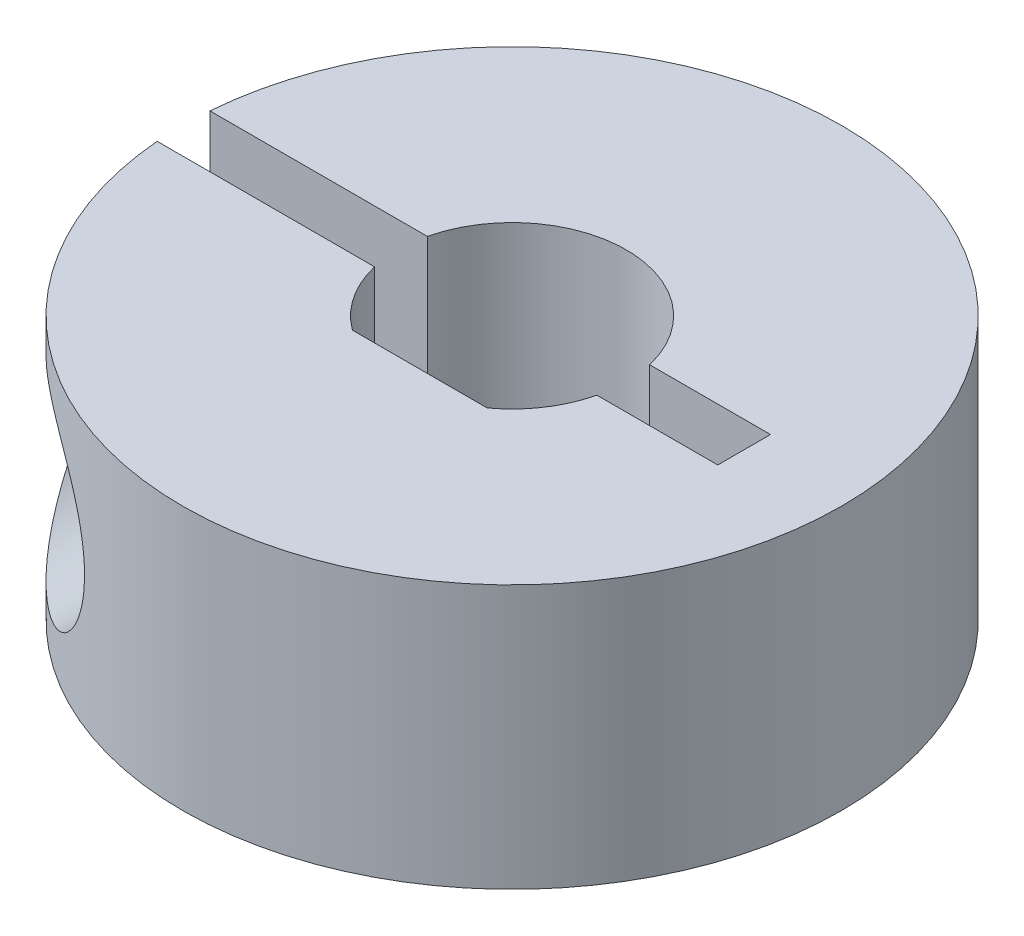
ISO-10303-21;
HEADER;
FILE_DESCRIPTION(('STEP AP214'),'2;1');
FILE_NAME('part.step','',(''),(''),'','','');
FILE_SCHEMA(('AUTOMOTIVE_DESIGN { 1 0 10303 214 1 1 1 1 }'));
ENDSEC;
DATA;
#1=APPLICATION_CONTEXT('core data for automotive mechanical design processes');
#2=APPLICATION_PROTOCOL_DEFINITION('international standard','automotive_design',2000,#1);
#3=PRODUCT_CONTEXT('',#1,'mechanical');
#4=PRODUCT('Part','Part','',(#3));
#5=PRODUCT_RELATED_PRODUCT_CATEGORY('part','',(#4));
#6=PRODUCT_DEFINITION_FORMATION('','',#4);
#7=PRODUCT_DEFINITION_CONTEXT('part definition',#1,'design');
#8=PRODUCT_DEFINITION('design','',#6,#7);
#9=PRODUCT_DEFINITION_SHAPE('','',#8);
#10=(LENGTH_UNIT() NAMED_UNIT(*) SI_UNIT(.MILLI.,.METRE.));
#11=(NAMED_UNIT(*) PLANE_ANGLE_UNIT() SI_UNIT($,.RADIAN.));
#12=(NAMED_UNIT(*) SI_UNIT($,.STERADIAN.) SOLID_ANGLE_UNIT());
#13=UNCERTAINTY_MEASURE_WITH_UNIT(LENGTH_MEASURE(1.E-05),#10,'distance_accuracy_value','');
#14=(GEOMETRIC_REPRESENTATION_CONTEXT(3) GLOBAL_UNCERTAINTY_ASSIGNED_CONTEXT((#13)) GLOBAL_UNIT_ASSIGNED_CONTEXT((#10,
#11,#12)) REPRESENTATION_CONTEXT('',''));
#15=CARTESIAN_POINT('',(0.,0.,0.));
#16=DIRECTION('',(0.,0.,1.));
#17=DIRECTION('',(1.,0.,0.));
#18=AXIS2_PLACEMENT_3D('',#15,#16,#17);
#19=CARTESIAN_POINT('',(-5.1,3.,1.));
#20=DIRECTION('',(0.,0.,1.));
#21=DIRECTION('',(1.,0.,0.));
#22=AXIS2_PLACEMENT_3D('',#19,#20,#21);
#23=CYLINDRICAL_SURFACE('',#22,1.2);
#24=CARTESIAN_POINT('',(-5.1,3.,1.));
#25=DIRECTION('',(0.,0.,1.));
#26=DIRECTION('',(1.,0.,0.));
#27=AXIS2_PLACEMENT_3D('',#24,#25,#26);
#28=CIRCLE('',#27,1.2);
#29=CARTESIAN_POINT('',(-3.9,3.,1.));
#30=VERTEX_POINT('',#29);
#31=EDGE_CURVE('E173',#30,#30,#28,.T.);
#32=ORIENTED_EDGE('',*,*,#31,.F.);
#33=EDGE_LOOP('',(#32));
#34=FACE_BOUND('',#33,.T.);
#35=CARTESIAN_POINT('',(-5.1,3.,3.));
#36=DIRECTION('',(0.,0.,1.));
#37=DIRECTION('',(1.,0.,0.));
#38=AXIS2_PLACEMENT_3D('',#35,#36,#37);
#39=CIRCLE('',#38,1.2);
#40=CARTESIAN_POINT('',(-3.9,3.,3.));
#41=VERTEX_POINT('',#40);
#42=EDGE_CURVE('E322',#41,#41,#39,.T.);
#43=ORIENTED_EDGE('',*,*,#42,.T.);
#44=EDGE_LOOP('',(#43));
#45=FACE_BOUND('',#44,.T.);
#46=ADVANCED_FACE('F43',(#34,#45),#23,.F.);
#47=CARTESIAN_POINT('',(-5.1,3.,1.));
#48=DIRECTION('',(0.,0.,1.));
#49=DIRECTION('',(1.,0.,0.));
#50=AXIS2_PLACEMENT_3D('',#47,#48,#49);
#51=PLANE('',#50);
#52=ORIENTED_EDGE('',*,*,#31,.T.);
#53=EDGE_LOOP('',(#52));
#54=FACE_BOUND('',#53,.T.);
#55=ADVANCED_FACE('F240',(#54),#51,.T.);
#56=CARTESIAN_POINT('',(-5.00289180238049,3.,7.5));
#57=DIRECTION('',(0.,0.,-1.));
#58=DIRECTION('',(-1.,0.,0.));
#59=AXIS2_PLACEMENT_3D('',#56,#57,#58);
#60=CYLINDRICAL_SURFACE('',#59,2.25);
#61=CARTESIAN_POINT('',(-6.87386354243376,1.75021411917,3.));
#62=CARTESIAN_POINT('',(-6.84514336746055,1.70724330427508,3.0658145929437));
#63=CARTESIAN_POINT('',(-6.81516819465504,1.66555217578708,3.13191010575274));
#64=CARTESIAN_POINT('',(-6.75270055703788,1.58462066491614,3.26441208257045));
#65=CARTESIAN_POINT('',(-6.72020809227526,1.54538028248546,3.33081854657306));
#66=CARTESIAN_POINT('',(-6.65263785772319,1.46917315907567,3.46381104087904));
#67=CARTESIAN_POINT('',(-6.61755554280518,1.43221063471329,3.5303971793205));
#68=CARTESIAN_POINT('',(-6.54484252941202,1.36064342128017,3.66343886202137));
#69=CARTESIAN_POINT('',(-6.50721181668045,1.32603874540204,3.72989440554805));
#70=CARTESIAN_POINT('',(-6.38954856601912,1.22504559063005,3.93037649436951));
#71=CARTESIAN_POINT('',(-6.30552429933281,1.16236125857017,4.06397319256161));
#72=CARTESIAN_POINT('',(-6.12686663500112,1.04797162040012,4.32862209617999));
#73=CARTESIAN_POINT('',(-6.03224226274425,0.996257081086065,4.45967635645737));
#74=CARTESIAN_POINT('',(-5.86725635996033,0.921425534691148,4.67296677351159));
#75=CARTESIAN_POINT('',(-5.79994656651594,0.894625817877258,4.75628390479375));
#76=CARTESIAN_POINT('',(-5.66089992122716,0.847112564089483,4.92095732320651));
#77=CARTESIAN_POINT('',(-5.58916321591468,0.826398825798741,5.0023136751156));
#78=CARTESIAN_POINT('',(-5.44170204938723,0.791911126046138,5.16233150828951));
#79=CARTESIAN_POINT('',(-5.36599285560214,0.778112477276814,5.2410016281868));
#80=CARTESIAN_POINT('',(-5.21071233329265,0.758251275718582,5.39541258624107));
#81=CARTESIAN_POINT('',(-5.13114196633303,0.752186807012471,5.47115414535357));
#82=CARTESIAN_POINT('',(-4.92445347705458,0.747872775226416,5.65936678517679));
#83=CARTESIAN_POINT('',(-4.79495237739256,0.755645242366067,5.76947988951533));
#84=CARTESIAN_POINT('',(-4.53109917931502,0.795988267348201,5.97891415043695));
#85=CARTESIAN_POINT('',(-4.39675177701858,0.828535402180042,6.07824539934521));
#86=CARTESIAN_POINT('',(-4.15261689004567,0.913589011363356,6.24689660181319));
#87=CARTESIAN_POINT('',(-4.04274411058669,0.961471463213277,6.31840441321241));
#88=CARTESIAN_POINT('',(-3.82747574452432,1.07754791314279,6.45107636916548));
#89=CARTESIAN_POINT('',(-3.72207853446985,1.14573447301925,6.51224428879105));
#90=CARTESIAN_POINT('',(-3.52011192592267,1.30284984091031,6.62361038838737));
#91=CARTESIAN_POINT('',(-3.42359821303967,1.39189852126495,6.67374179583125));
#92=CARTESIAN_POINT('',(-3.24543639202402,1.58881246763005,6.76217936379898));
#93=CARTESIAN_POINT('',(-3.16378273177717,1.69667067627869,6.80048994463671));
#94=CARTESIAN_POINT('',(-3.02768047694257,1.9156191048011,6.86208102540269));
#95=CARTESIAN_POINT('',(-2.97127163220871,2.02517061302621,6.88652005559272));
#96=CARTESIAN_POINT('',(-2.87678057830789,2.25341436961978,6.9265275935542));
#97=CARTESIAN_POINT('',(-2.83869305421648,2.37210395547276,6.94209867411535));
#98=CARTESIAN_POINT('',(-2.7839551494487,2.60899498878214,6.96422467302576));
#99=CARTESIAN_POINT('',(-2.76635432800776,2.72694071784374,6.97118038806068));
#100=CARTESIAN_POINT('',(-2.75003229855003,2.96432837435543,6.97763599928819));
#101=CARTESIAN_POINT('',(-2.75130884223376,3.08377012193629,6.97713678336507));
#102=CARTESIAN_POINT('',(-2.77257404404054,3.31942645469555,6.96871270661956));
#103=CARTESIAN_POINT('',(-2.79236461939619,3.43566181209186,6.96086645139139));
#104=CARTESIAN_POINT('',(-2.84957571151077,3.66291539568349,6.93764099828048));
#105=CARTESIAN_POINT('',(-2.88699542923405,3.77393385808225,6.92226214180941));
#106=CARTESIAN_POINT('',(-2.97805203908749,3.98796975361054,6.88357785911471));
#107=CARTESIAN_POINT('',(-3.03173127356089,4.09096540292061,6.86025171687176));
#108=CARTESIAN_POINT('',(-3.15301719588664,4.28594235607694,6.8053579076353));
#109=CARTESIAN_POINT('',(-3.22062360063832,4.37792388374959,6.7737904081622));
#110=CARTESIAN_POINT('',(-3.36848063102568,4.55060947079113,6.70150949417233));
#111=CARTESIAN_POINT('',(-3.44896604793873,4.6310375629513,6.66061867262551));
#112=CARTESIAN_POINT('',(-3.618178363544,4.7769530035665,6.57023428147925));
#113=CARTESIAN_POINT('',(-3.70690687385683,4.84243742167291,6.52073902795833));
#114=CARTESIAN_POINT('',(-3.89529924034776,4.96188468711795,6.41009656758613));
#115=CARTESIAN_POINT('',(-3.99529824331537,5.01479968923515,6.34839538273607));
#116=CARTESIAN_POINT('',(-4.19730898134768,5.10374270256589,6.21668268570796));
#117=CARTESIAN_POINT('',(-4.29932176191436,5.13976168798583,6.14666675679067));
#118=CARTESIAN_POINT('',(-4.4727775747814,5.18793513703765,6.0209782854254));
#119=CARTESIAN_POINT('',(-4.54446529356828,5.20398530991342,5.96707235264336));
#120=CARTESIAN_POINT('',(-4.68663275178896,5.22883120840226,5.85607565820179));
#121=CARTESIAN_POINT('',(-4.75711209121311,5.23762457552605,5.79898386755749));
#122=CARTESIAN_POINT('',(-4.9659591261406,5.25402986772425,5.62336470723954));
#123=CARTESIAN_POINT('',(-5.10163020480338,5.25163987097105,5.50056981683602));
#124=CARTESIAN_POINT('',(-5.32150258152356,5.22915029821429,5.2865256214974));
#125=CARTESIAN_POINT('',(-5.40853685689313,5.2148196314692,5.19741299388768));
#126=CARTESIAN_POINT('',(-5.57722422031252,5.17717810874831,5.01596321239898));
#127=CARTESIAN_POINT('',(-5.65887524673883,5.15386383544702,4.92362484363136));
#128=CARTESIAN_POINT('',(-5.81666176089845,5.09934965676656,4.73619143729148));
#129=CARTESIAN_POINT('',(-5.89278175622056,5.06812862334062,4.64108962788111));
#130=CARTESIAN_POINT('',(-6.03918214493924,4.99879029236199,4.44891793325777));
#131=CARTESIAN_POINT('',(-6.10946151918054,4.9606717949126,4.35184770822825));
#132=CARTESIAN_POINT('',(-6.24806850281715,4.8759035027134,4.1505930745781));
#133=CARTESIAN_POINT('',(-6.31604610525391,4.82888696694417,4.04632274552977));
#134=CARTESIAN_POINT('',(-6.44550183803214,4.72860694182086,3.83675369021599));
#135=CARTESIAN_POINT('',(-6.50697914772509,4.67534266548873,3.73145483593012));
#136=CARTESIAN_POINT('',(-6.62295897847548,4.56343164561002,3.52145673501557));
#137=CARTESIAN_POINT('',(-6.6775221617249,4.50484078758067,3.41676128328699));
#138=CARTESIAN_POINT('',(-6.75466761552686,4.41258141494622,3.26003934364243));
#139=CARTESIAN_POINT('',(-6.77959592536628,4.3811048415694,3.20786057907936));
#140=CARTESIAN_POINT('',(-6.82789616176746,4.31661567984451,3.10372868998453));
#141=CARTESIAN_POINT('',(-6.85126801081366,4.28360301513419,3.05177557681102));
#142=CARTESIAN_POINT('',(-6.87386354243376,4.24978588083,3.));
#143=B_SPLINE_CURVE_WITH_KNOTS('',3,(#61,#62,#63,#64,#65,#66,#67,#68,#69,#70,#71,#72,#73,#74,
#75,#76,#77,#78,#79,#80,#81,#82,#83,#84,#85,#86,#87,#88,#89,#90,#91,#92,#93,#94,#95,#96,#97,#98,
#99,#100,#101,#102,#103,#104,#105,#106,#107,#108,#109,#110,#111,#112,#113,#114,#115,#116,#117,
#118,#119,#120,#121,#122,#123,#124,#125,#126,#127,#128,#129,#130,#131,#132,#133,#134,#135,#136,
#137,#138,#139,#140,#141,#142),.UNSPECIFIED.,.F.,.F.,(4,2,2,2,2,2,2,2,2,2,2,2,2,2,2,2,2,2,2,2,2,
2,2,2,2,2,2,2,2,2,2,2,2,2,2,2,2,2,2,2,4),(0.,0.251021942592843,0.502043880295764,
0.75351733766447,1.00499220195967,1.51375279389565,2.02208345107432,2.35307819507163,
2.68406198892748,3.01385557852207,3.34356745550883,3.85209380336044,4.36013996529898,
4.77710996749608,5.19392740451478,5.61320127665754,6.03231817377849,6.40726267472243,
6.78209834042831,7.13874748988281,7.49535416266561,7.84818858948757,8.20100702573215,
8.55475227338067,8.90849033108075,9.26962361165777,9.63082764717771,10.0159100299542,
10.4011978887996,10.6741991411284,10.9472890849919,11.4938632139342,11.8695968482162,
12.2454735512887,12.6223654509059,12.9993229785383,13.3981583941002,13.7970441018382,
14.1921438278654,14.3896303579807,14.5871267160664),.UNSPECIFIED.);
#144=CARTESIAN_POINT('',(-6.87386354243376,1.75021411917,3.));
#145=VERTEX_POINT('',#144);
#146=CARTESIAN_POINT('',(-6.87386354243376,4.24978588083,3.));
#147=VERTEX_POINT('',#146);
#148=EDGE_CURVE('E11',#145,#147,#143,.T.);
#149=ORIENTED_EDGE('',*,*,#148,.T.);
#150=CARTESIAN_POINT('',(-5.00289180238049,3.,3.));
#151=DIRECTION('',(0.,0.,1.));
#152=DIRECTION('',(1.,0.,0.));
#153=AXIS2_PLACEMENT_3D('',#150,#151,#152);
#154=CIRCLE('',#153,2.25);
#155=EDGE_CURVE('E60',#145,#147,#154,.T.);
#156=ORIENTED_EDGE('',*,*,#155,.F.);
#157=EDGE_LOOP('',(#149,#156));
#158=FACE_BOUND('',#157,.T.);
#159=ADVANCED_FACE('F234',(#158),#60,.F.);
#160=CARTESIAN_POINT('',(-5.00289180238049,3.,3.));
#161=DIRECTION('',(0.,0.,1.));
#162=DIRECTION('',(1.,0.,0.));
#163=AXIS2_PLACEMENT_3D('',#160,#161,#162);
#164=PLANE('',#163);
#165=ORIENTED_EDGE('',*,*,#42,.F.);
#166=EDGE_LOOP('',(#165));
#167=FACE_BOUND('',#166,.T.);
#168=DIRECTION('',(0.,-1.,0.));
#169=VECTOR('',#168,1.);
#170=CARTESIAN_POINT('',(-6.87386354243376,6.,3.));
#171=LINE('',#170,#169);
#172=EDGE_CURVE('E54',#147,#145,#171,.T.);
#173=ORIENTED_EDGE('',*,*,#172,.T.);
#174=ORIENTED_EDGE('',*,*,#155,.T.);
#175=EDGE_LOOP('',(#173,#174));
#176=FACE_BOUND('',#175,.T.);
#177=ADVANCED_FACE('F239',(#167,#176),#164,.T.);
#178=CARTESIAN_POINT('',(0.,6.,0.));
#179=DIRECTION('',(0.,-1.,0.));
#180=DIRECTION('',(0.,0.,-1.));
#181=AXIS2_PLACEMENT_3D('',#178,#179,#180);
#182=CYLINDRICAL_SURFACE('',#181,7.5);
#183=CARTESIAN_POINT('',(-4.015,3.,-6.33480662688294));
#184=CARTESIAN_POINT('',(-4.01500341673465,3.05348955366232,-6.3348051350838));
#185=CARTESIAN_POINT('',(-4.01898062277794,3.10703852283346,-6.33228912967999));
#186=CARTESIAN_POINT('',(-4.03468449784157,3.21256531529099,-6.32229415504269));
#187=CARTESIAN_POINT('',(-4.04642456460871,3.26454025952914,-6.31480660543988));
#188=CARTESIAN_POINT('',(-4.07697190949871,3.36523575540195,-6.29512716706745));
#189=CARTESIAN_POINT('',(-4.09575691217133,3.41396600052346,-6.28295010289053));
#190=CARTESIAN_POINT('',(-4.13945211238199,3.50717265460946,-6.25424784255655));
#191=CARTESIAN_POINT('',(-4.16436124711331,3.5516497998159,-6.2377234008262));
#192=CARTESIAN_POINT('',(-4.22045042684689,3.63746605159121,-6.19991846019641));
#193=CARTESIAN_POINT('',(-4.25186333738993,3.67857189618531,-6.17845649535215));
#194=CARTESIAN_POINT('',(-4.31889091442411,3.75476626871302,-6.131790112999));
#195=CARTESIAN_POINT('',(-4.35450708249521,3.78985263518617,-6.10658435721439));
#196=CARTESIAN_POINT('',(-4.43389300199358,3.85827713523543,-6.0492398496911));
#197=CARTESIAN_POINT('',(-4.47810826140357,3.89069634026397,-6.01662439989254));
#198=CARTESIAN_POINT('',(-4.56889160441162,3.9476427741786,-5.94798146285112));
#199=CARTESIAN_POINT('',(-4.61546153973329,3.97216367652555,-5.91195127014704));
#200=CARTESIAN_POINT('',(-4.73224883804518,4.02360834748027,-5.81925101369104));
#201=CARTESIAN_POINT('',(-4.80313823457782,4.04608717657006,-5.76094143092151));
#202=CARTESIAN_POINT('',(-4.94446871309752,4.07623244608567,-5.64011812391005));
#203=CARTESIAN_POINT('',(-5.01490882888358,4.08387365785588,-5.57759742581558));
#204=CARTESIAN_POINT('',(-5.17015967955018,4.0861395223418,-5.43443617645868));
#205=CARTESIAN_POINT('',(-5.25434035899845,4.0771815487492,-5.35306131996549));
#206=CARTESIAN_POINT('',(-5.41702565743701,4.04100498031075,-5.18837821427705));
#207=CARTESIAN_POINT('',(-5.4955162438066,4.01374283574663,-5.10506581265534));
#208=CARTESIAN_POINT('',(-5.6079886320274,3.9596475514279,-4.98032823645102));
#209=CARTESIAN_POINT('',(-5.64479592099652,3.93926130163159,-4.93855095711596));
#210=CARTESIAN_POINT('',(-5.71627941162541,3.89398829176345,-4.85562931979364));
#211=CARTESIAN_POINT('',(-5.75095671295823,3.86910388062464,-4.81448464357256));
#212=CARTESIAN_POINT('',(-5.81780765254223,3.81475600895106,-4.73348325946805));
#213=CARTESIAN_POINT('',(-5.84998941889333,3.78530843943108,-4.69362264078427));
#214=CARTESIAN_POINT('',(-5.91157957845374,3.72147697028081,-4.61580777890537));
#215=CARTESIAN_POINT('',(-5.94099118179187,3.68709890378771,-4.57785135354266));
#216=CARTESIAN_POINT('',(-5.99344109786722,3.61699874992589,-4.50891657082794));
#217=CARTESIAN_POINT('',(-6.01682456939453,3.58184243701466,-4.47763020192026));
#218=CARTESIAN_POINT('',(-6.06032788341993,3.5068258654049,-4.41857059617814));
#219=CARTESIAN_POINT('',(-6.08045034713272,3.46696942966271,-4.39079454172905));
#220=CARTESIAN_POINT('',(-6.11353779102296,3.38916584653191,-4.34457478732529));
#221=CARTESIAN_POINT('',(-6.12713455702635,3.35196185943643,-4.32534801487973));
#222=CARTESIAN_POINT('',(-6.15055610531774,3.27421825770889,-4.29197825206541));
#223=CARTESIAN_POINT('',(-6.16038735749879,3.23368451116157,-4.2778265444275));
#224=CARTESIAN_POINT('',(-6.17398903312116,3.15798146265463,-4.25816575567804));
#225=CARTESIAN_POINT('',(-6.17855529646182,3.12325269996208,-4.25152658881075));
#226=CARTESIAN_POINT('',(-6.18428039363398,3.05293408341792,-4.24319493362013));
#227=CARTESIAN_POINT('',(-6.18544186925664,3.01734491878693,-4.24149861012699));
#228=CARTESIAN_POINT('',(-6.18425423160318,2.94633937586732,-4.24322992836885));
#229=CARTESIAN_POINT('',(-6.1819036148408,2.91092307809355,-4.24665976455392));
#230=CARTESIAN_POINT('',(-6.17390022978676,2.84126693448786,-4.25828652432629));
#231=CARTESIAN_POINT('',(-6.16824458123418,2.80702814241773,-4.26648760591902));
#232=CARTESIAN_POINT('',(-6.15189110630574,2.7303370798303,-4.29004611267863));
#233=CARTESIAN_POINT('',(-6.1401847536936,2.68853944433576,-4.30681895761351));
#234=CARTESIAN_POINT('',(-6.11288886679776,2.60875951970556,-4.34547477616115));
#235=CARTESIAN_POINT('',(-6.09729099015716,2.57078567642739,-4.36736872162278));
#236=CARTESIAN_POINT('',(-6.05388507311197,2.47933317531338,-4.42746797342534));
#237=CARTESIAN_POINT('',(-6.02401532908021,2.42846336576144,-4.4681233705646));
#238=CARTESIAN_POINT('',(-5.95910382770025,2.33485312361478,-4.55434055995884));
#239=CARTESIAN_POINT('',(-5.92404955306475,2.29213295526797,-4.59991415240176));
#240=CARTESIAN_POINT('',(-5.85836701193417,2.2229384556394,-4.68312647443183));
#241=CARTESIAN_POINT('',(-5.82855721217563,2.19498233870916,-4.72019932405328));
#242=CARTESIAN_POINT('',(-5.76682075764876,2.14314512635089,-4.79543043672289));
#243=CARTESIAN_POINT('',(-5.73489303441219,2.11926610981905,-4.83358924199497));
#244=CARTESIAN_POINT('',(-5.63624945989467,2.05346839522171,-4.94902993293104));
#245=CARTESIAN_POINT('',(-5.5666747241499,2.01739058652626,-5.02727414829057));
#246=CARTESIAN_POINT('',(-5.41935829865167,1.95997334358773,-5.18581007327568));
#247=CARTESIAN_POINT('',(-5.34144207220131,1.93907647494963,-5.26609754490103));
#248=CARTESIAN_POINT('',(-5.18066655635745,1.91496311528892,-5.42432948863842));
#249=CARTESIAN_POINT('',(-5.0978139335292,1.91172330217349,-5.50227691608397));
#250=CARTESIAN_POINT('',(-4.94755286635842,1.92371764771268,-5.63734493746068));
#251=CARTESIAN_POINT('',(-4.88063669967706,1.93514417638944,-5.69535090593003));
#252=CARTESIAN_POINT('',(-4.74701160212433,1.97169707025619,-5.80718743466338));
#253=CARTESIAN_POINT('',(-4.68030251833578,1.99680680118408,-5.86102297421644));
#254=CARTESIAN_POINT('',(-4.56293097725754,2.0554478032015,-5.95265129519667));
#255=CARTESIAN_POINT('',(-4.51173876486878,2.08627102172864,-5.9914933997724));
#256=CARTESIAN_POINT('',(-4.41312096128956,2.15790515200411,-6.06449593770924));
#257=CARTESIAN_POINT('',(-4.36569105231279,2.19870438859472,-6.09866177143235));
#258=CARTESIAN_POINT('',(-4.2839243285766,2.28297163675549,-6.15630548044958));
#259=CARTESIAN_POINT('',(-4.24870209824042,2.32500565951047,-6.18061917506632));
#260=CARTESIAN_POINT('',(-4.18412666540861,2.41562711040452,-6.2245168195216));
#261=CARTESIAN_POINT('',(-4.15477415488214,2.4642153100727,-6.24410021177106));
#262=CARTESIAN_POINT('',(-4.10336517237299,2.56724079531082,-6.27800564032322));
#263=CARTESIAN_POINT('',(-4.08135637067195,2.62171337037392,-6.29229336465322));
#264=CARTESIAN_POINT('',(-4.04631772229561,2.73457442084717,-6.31488371005586));
#265=CARTESIAN_POINT('',(-4.03326635240318,2.79295313701484,-6.32320068008735));
#266=CARTESIAN_POINT('',(-4.02175334367412,2.87662223589476,-6.33052220433555));
#267=CARTESIAN_POINT('',(-4.01922508574751,2.90119814716857,-6.33212709558405));
#268=CARTESIAN_POINT('',(-4.01584764969188,2.95051180195049,-6.33426963529976));
#269=CARTESIAN_POINT('',(-4.01499841902302,2.97524954037043,-6.33480731716191));
#270=CARTESIAN_POINT('',(-4.015,3.,-6.33480662688294));
#271=B_SPLINE_CURVE_WITH_KNOTS('',3,(#183,#184,#185,#186,#187,#188,#189,#190,#191,#192,#193,
#194,#195,#196,#197,#198,#199,#200,#201,#202,#203,#204,#205,#206,#207,#208,#209,#210,#211,#212,
#213,#214,#215,#216,#217,#218,#219,#220,#221,#222,#223,#224,#225,#226,#227,#228,#229,#230,#231,
#232,#233,#234,#235,#236,#237,#238,#239,#240,#241,#242,#243,#244,#245,#246,#247,#248,#249,#250,
#251,#252,#253,#254,#255,#256,#257,#258,#259,#260,#261,#262,#263,#264,#265,#266,#267,#268,#269,
#270),.UNSPECIFIED.,.T.,.F.,(4,2,2,2,2,2,2,2,2,2,2,2,2,2,2,2,2,2,2,2,2,2,2,2,2,2,2,2,2,2,2,2,2,
2,2,2,2,2,2,2,2,2,2,4),(0.,0.160369376208794,0.321016255273978,0.481159408317814,
0.641274789062684,0.808639770935063,0.976064724628677,1.16673291826196,1.35755345947203,
1.63950342230103,1.92193237114998,2.27245758298603,2.62381974201019,2.80153115175063,
2.97915002755233,3.15616370557318,3.33296966506322,3.49028814482599,3.64747953716923,
3.77911365957614,3.91052058308015,4.01700586906495,4.12340851070681,4.22985671514576,
4.33639782543818,4.47521995491429,4.61434227711114,4.82808765314693,5.04235777494466,
5.20767554615037,5.37307736206745,5.70388964462102,6.04399636883553,6.38365375842484,
6.65057336946613,6.91716921581238,7.13016684680134,7.34291638507388,7.52213620932931,
7.70137714900094,7.88175993483504,8.06170775897888,8.1359155193699,8.21012095762675),.UNSPECIFIED.);
#272=CARTESIAN_POINT('',(-4.015,3.,-6.33480662688294));
#273=VERTEX_POINT('',#272);
#274=EDGE_CURVE('E331',#273,#273,#271,.T.);
#275=ORIENTED_EDGE('',*,*,#274,.T.);
#276=EDGE_LOOP('',(#275));
#277=FACE_BOUND('',#276,.T.);
#278=CARTESIAN_POINT('',(0.,0.,0.));
#279=DIRECTION('',(0.,1.,0.));
#280=DIRECTION('',(0.,0.,1.));
#281=AXIS2_PLACEMENT_3D('',#278,#279,#280);
#282=CIRCLE('',#281,7.5);
#283=CARTESIAN_POINT('',(-7.47596147662627,0.,0.600000000000002));
#284=VERTEX_POINT('',#283);
#285=CARTESIAN_POINT('',(-7.47596147662627,0.,-0.599999999999998));
#286=VERTEX_POINT('',#285);
#287=EDGE_CURVE('E168',#284,#286,#282,.T.);
#288=ORIENTED_EDGE('',*,*,#287,.T.);
#289=DIRECTION('',(0.,-1.,0.));
#290=VECTOR('',#289,1.);
#291=CARTESIAN_POINT('',(-7.47596147662627,6.,-0.599999999999998));
#292=LINE('',#291,#290);
#293=CARTESIAN_POINT('',(-7.47596147662627,6.,-0.599999999999998));
#294=VERTEX_POINT('',#293);
#295=EDGE_CURVE('E225',#294,#286,#292,.T.);
#296=ORIENTED_EDGE('',*,*,#295,.F.);
#297=CARTESIAN_POINT('',(0.,6.,0.));
#298=DIRECTION('',(0.,1.,0.));
#299=DIRECTION('',(0.,0.,1.));
#300=AXIS2_PLACEMENT_3D('',#297,#298,#299);
#301=CIRCLE('',#300,7.5);
#302=CARTESIAN_POINT('',(-7.47596147662627,6.,0.600000000000002));
#303=VERTEX_POINT('',#302);
#304=EDGE_CURVE('E198',#303,#294,#301,.T.);
#305=ORIENTED_EDGE('',*,*,#304,.F.);
#306=DIRECTION('',(0.,-1.,0.));
#307=VECTOR('',#306,1.);
#308=CARTESIAN_POINT('',(-7.47596147662627,6.,0.600000000000002));
#309=LINE('',#308,#307);
#310=EDGE_CURVE('E164',#303,#284,#309,.T.);
#311=ORIENTED_EDGE('',*,*,#310,.T.);
#312=EDGE_LOOP('',(#288,#296,#305,#311));
#313=FACE_BOUND('',#312,.T.);
#314=ORIENTED_EDGE('',*,*,#148,.F.);
#315=ORIENTED_EDGE('',*,*,#172,.F.);
#316=EDGE_LOOP('',(#314,#315));
#317=FACE_BOUND('',#316,.T.);
#318=ADVANCED_FACE('F45',(#277,#313,#317),#182,.T.);
#319=CARTESIAN_POINT('',(-7.47596147662627,6.,-0.599999999999998));
#320=DIRECTION('',(0.,0.,-1.));
#321=DIRECTION('',(-1.,0.,0.));
#322=AXIS2_PLACEMENT_3D('',#319,#320,#321);
#323=PLANE('',#322);
#324=CARTESIAN_POINT('',(-5.1,3.,-0.599999999999998));
#325=DIRECTION('',(0.,0.,-1.));
#326=DIRECTION('',(-1.,0.,0.));
#327=AXIS2_PLACEMENT_3D('',#324,#325,#326);
#328=CIRCLE('',#327,1.085);
#329=CARTESIAN_POINT('',(-6.185,3.,-0.599999999999998));
#330=VERTEX_POINT('',#329);
#331=EDGE_CURVE('E48',#330,#330,#328,.T.);
#332=ORIENTED_EDGE('',*,*,#331,.T.);
#333=EDGE_LOOP('',(#332));
#334=FACE_BOUND('',#333,.T.);
#335=DIRECTION('',(1.,0.,0.));
#336=VECTOR('',#335,1.);
#337=CARTESIAN_POINT('',(-7.47596147662627,0.,-0.599999999999998));
#338=LINE('',#337,#336);
#339=CARTESIAN_POINT('',(-2.5298221281347,0.,-0.599999999999998));
#340=VERTEX_POINT('',#339);
#341=EDGE_CURVE('E172',#286,#340,#338,.T.);
#342=ORIENTED_EDGE('',*,*,#341,.T.);
#343=DIRECTION('',(0.,-1.,0.));
#344=VECTOR('',#343,1.);
#345=CARTESIAN_POINT('',(-2.5298221281347,6.,-0.599999999999998));
#346=LINE('',#345,#344);
#347=CARTESIAN_POINT('',(-2.5298221281347,6.,-0.599999999999998));
#348=VERTEX_POINT('',#347);
#349=EDGE_CURVE('E221',#348,#340,#346,.T.);
#350=ORIENTED_EDGE('',*,*,#349,.F.);
#351=DIRECTION('',(1.,0.,0.));
#352=VECTOR('',#351,1.);
#353=CARTESIAN_POINT('',(-7.47596147662627,6.,-0.599999999999998));
#354=LINE('',#353,#352);
#355=EDGE_CURVE('E116',#294,#348,#354,.T.);
#356=ORIENTED_EDGE('',*,*,#355,.F.);
#357=ORIENTED_EDGE('',*,*,#295,.T.);
#358=EDGE_LOOP('',(#342,#350,#356,#357));
#359=FACE_BOUND('',#358,.T.);
#360=ADVANCED_FACE('F281',(#334,#359),#323,.F.);
#361=CARTESIAN_POINT('',(0.,6.,0.));
#362=DIRECTION('',(0.,-1.,0.));
#363=DIRECTION('',(0.,0.,-1.));
#364=AXIS2_PLACEMENT_3D('',#361,#362,#363);
#365=CYLINDRICAL_SURFACE('',#364,2.6);
#366=CARTESIAN_POINT('',(0.,0.,0.));
#367=DIRECTION('',(0.,-1.,0.));
#368=DIRECTION('',(0.,0.,1.));
#369=AXIS2_PLACEMENT_3D('',#366,#367,#368);
#370=CIRCLE('',#369,2.6);
#371=CARTESIAN_POINT('',(2.5298221281347,0.,-0.6));
#372=VERTEX_POINT('',#371);
#373=EDGE_CURVE('E176',#340,#372,#370,.T.);
#374=ORIENTED_EDGE('',*,*,#373,.T.);
#375=DIRECTION('',(0.,-1.,0.));
#376=VECTOR('',#375,1.);
#377=CARTESIAN_POINT('',(2.5298221281347,6.,-0.6));
#378=LINE('',#377,#376);
#379=CARTESIAN_POINT('',(2.5298221281347,6.,-0.6));
#380=VERTEX_POINT('',#379);
#381=EDGE_CURVE('E217',#380,#372,#378,.T.);
#382=ORIENTED_EDGE('',*,*,#381,.F.);
#383=CARTESIAN_POINT('',(0.,6.,0.));
#384=DIRECTION('',(0.,-1.,0.));
#385=DIRECTION('',(0.,0.,1.));
#386=AXIS2_PLACEMENT_3D('',#383,#384,#385);
#387=CIRCLE('',#386,2.6);
#388=EDGE_CURVE('E296',#348,#380,#387,.T.);
#389=ORIENTED_EDGE('',*,*,#388,.F.);
#390=ORIENTED_EDGE('',*,*,#349,.T.);
#391=EDGE_LOOP('',(#374,#382,#389,#390));
#392=FACE_BOUND('',#391,.T.);
#393=ADVANCED_FACE('F278',(#392),#365,.F.);
#394=CARTESIAN_POINT('',(2.5298221281347,6.,-0.6));
#395=DIRECTION('',(0.,0.,-1.));
#396=DIRECTION('',(-1.,0.,0.));
#397=AXIS2_PLACEMENT_3D('',#394,#395,#396);
#398=PLANE('',#397);
#399=DIRECTION('',(1.,0.,0.));
#400=VECTOR('',#399,1.);
#401=CARTESIAN_POINT('',(2.5298221281347,0.,-0.6));
#402=LINE('',#401,#400);
#403=CARTESIAN_POINT('',(5.2798221281347,0.,-0.6));
#404=VERTEX_POINT('',#403);
#405=EDGE_CURVE('E179',#372,#404,#402,.T.);
#406=ORIENTED_EDGE('',*,*,#405,.T.);
#407=DIRECTION('',(0.,-1.,0.));
#408=VECTOR('',#407,1.);
#409=CARTESIAN_POINT('',(5.2798221281347,6.,-0.6));
#410=LINE('',#409,#408);
#411=CARTESIAN_POINT('',(5.2798221281347,6.,-0.6));
#412=VERTEX_POINT('',#411);
#413=EDGE_CURVE('E213',#412,#404,#410,.T.);
#414=ORIENTED_EDGE('',*,*,#413,.F.);
#415=DIRECTION('',(1.,0.,0.));
#416=VECTOR('',#415,1.);
#417=CARTESIAN_POINT('',(2.5298221281347,6.,-0.6));
#418=LINE('',#417,#416);
#419=EDGE_CURVE('E308',#380,#412,#418,.T.);
#420=ORIENTED_EDGE('',*,*,#419,.F.);
#421=ORIENTED_EDGE('',*,*,#381,.T.);
#422=EDGE_LOOP('',(#406,#414,#420,#421));
#423=FACE_BOUND('',#422,.T.);
#424=ADVANCED_FACE('F274',(#423),#398,.F.);
#425=CARTESIAN_POINT('',(5.2798221281347,6.,-0.6));
#426=DIRECTION('',(1.,0.,0.));
#427=DIRECTION('',(0.,0.,-1.));
#428=AXIS2_PLACEMENT_3D('',#425,#426,#427);
#429=PLANE('',#428);
#430=DIRECTION('',(0.,0.,1.));
#431=VECTOR('',#430,1.);
#432=CARTESIAN_POINT('',(5.2798221281347,0.,-0.6));
#433=LINE('',#432,#431);
#434=CARTESIAN_POINT('',(5.2798221281347,0.,0.6));
#435=VERTEX_POINT('',#434);
#436=EDGE_CURVE('E182',#404,#435,#433,.T.);
#437=ORIENTED_EDGE('',*,*,#436,.T.);
#438=DIRECTION('',(0.,-1.,0.));
#439=VECTOR('',#438,1.);
#440=CARTESIAN_POINT('',(5.2798221281347,6.,0.6));
#441=LINE('',#440,#439);
#442=CARTESIAN_POINT('',(5.2798221281347,6.,0.6));
#443=VERTEX_POINT('',#442);
#444=EDGE_CURVE('E209',#443,#435,#441,.T.);
#445=ORIENTED_EDGE('',*,*,#444,.F.);
#446=DIRECTION('',(0.,0.,1.));
#447=VECTOR('',#446,1.);
#448=CARTESIAN_POINT('',(5.2798221281347,6.,-0.6));
#449=LINE('',#448,#447);
#450=EDGE_CURVE('E304',#412,#443,#449,.T.);
#451=ORIENTED_EDGE('',*,*,#450,.F.);
#452=ORIENTED_EDGE('',*,*,#413,.T.);
#453=EDGE_LOOP('',(#437,#445,#451,#452));
#454=FACE_BOUND('',#453,.T.);
#455=ADVANCED_FACE('F270',(#454),#429,.F.);
#456=CARTESIAN_POINT('',(5.2798221281347,6.,0.6));
#457=DIRECTION('',(0.,0.,1.));
#458=DIRECTION('',(1.,0.,0.));
#459=AXIS2_PLACEMENT_3D('',#456,#457,#458);
#460=PLANE('',#459);
#461=DIRECTION('',(-1.,0.,0.));
#462=VECTOR('',#461,1.);
#463=CARTESIAN_POINT('',(5.2798221281347,0.,0.6));
#464=LINE('',#463,#462);
#465=CARTESIAN_POINT('',(2.5298221281347,0.,0.600000000000001));
#466=VERTEX_POINT('',#465);
#467=EDGE_CURVE('E185',#435,#466,#464,.T.);
#468=ORIENTED_EDGE('',*,*,#467,.T.);
#469=DIRECTION('',(0.,-1.,0.));
#470=VECTOR('',#469,1.);
#471=CARTESIAN_POINT('',(2.5298221281347,6.,0.600000000000001));
#472=LINE('',#471,#470);
#473=CARTESIAN_POINT('',(2.5298221281347,6.,0.600000000000001));
#474=VERTEX_POINT('',#473);
#475=EDGE_CURVE('E205',#474,#466,#472,.T.);
#476=ORIENTED_EDGE('',*,*,#475,.F.);
#477=DIRECTION('',(-1.,0.,0.));
#478=VECTOR('',#477,1.);
#479=CARTESIAN_POINT('',(5.2798221281347,6.,0.6));
#480=LINE('',#479,#478);
#481=EDGE_CURVE('E307',#443,#474,#480,.T.);
#482=ORIENTED_EDGE('',*,*,#481,.F.);
#483=ORIENTED_EDGE('',*,*,#444,.T.);
#484=EDGE_LOOP('',(#468,#476,#482,#483));
#485=FACE_BOUND('',#484,.T.);
#486=ADVANCED_FACE('F266',(#485),#460,.F.);
#487=CARTESIAN_POINT('',(0.,6.,0.));
#488=DIRECTION('',(0.,-1.,0.));
#489=DIRECTION('',(0.,0.,-1.));
#490=AXIS2_PLACEMENT_3D('',#487,#488,#489);
#491=CYLINDRICAL_SURFACE('',#490,2.6);
#492=CARTESIAN_POINT('',(0.,0.,0.));
#493=DIRECTION('',(0.,-1.,0.));
#494=DIRECTION('',(0.,0.,1.));
#495=AXIS2_PLACEMENT_3D('',#492,#493,#494);
#496=CIRCLE('',#495,2.6);
#497=CARTESIAN_POINT('',(1.53297097167559,0.,2.1));
#498=VERTEX_POINT('',#497);
#499=EDGE_CURVE('E188',#466,#498,#496,.T.);
#500=ORIENTED_EDGE('',*,*,#499,.T.);
#501=DIRECTION('',(0.,-1.,0.));
#502=VECTOR('',#501,1.);
#503=CARTESIAN_POINT('',(1.53297097167559,6.,2.1));
#504=LINE('',#503,#502);
#505=CARTESIAN_POINT('',(1.53297097167559,6.,2.1));
#506=VERTEX_POINT('',#505);
#507=EDGE_CURVE('E157',#506,#498,#504,.T.);
#508=ORIENTED_EDGE('',*,*,#507,.F.);
#509=CARTESIAN_POINT('',(0.,6.,0.));
#510=DIRECTION('',(0.,-1.,0.));
#511=DIRECTION('',(0.,0.,1.));
#512=AXIS2_PLACEMENT_3D('',#509,#510,#511);
#513=CIRCLE('',#512,2.6);
#514=EDGE_CURVE('E143',#474,#506,#513,.T.);
#515=ORIENTED_EDGE('',*,*,#514,.F.);
#516=ORIENTED_EDGE('',*,*,#475,.T.);
#517=EDGE_LOOP('',(#500,#508,#515,#516));
#518=FACE_BOUND('',#517,.T.);
#519=ADVANCED_FACE('F263',(#518),#491,.F.);
#520=CARTESIAN_POINT('',(-1.53297097167559,6.,2.1));
#521=DIRECTION('',(0.,0.,1.));
#522=DIRECTION('',(1.,0.,0.));
#523=AXIS2_PLACEMENT_3D('',#520,#521,#522);
#524=PLANE('',#523);
#525=DIRECTION('',(-1.,0.,0.));
#526=VECTOR('',#525,1.);
#527=CARTESIAN_POINT('',(-1.53297097167559,0.,2.1));
#528=LINE('',#527,#526);
#529=CARTESIAN_POINT('',(-1.53297097167559,0.,2.1));
#530=VERTEX_POINT('',#529);
#531=EDGE_CURVE('E153',#498,#530,#528,.T.);
#532=ORIENTED_EDGE('',*,*,#531,.T.);
#533=DIRECTION('',(0.,-1.,0.));
#534=VECTOR('',#533,1.);
#535=CARTESIAN_POINT('',(-1.53297097167559,6.,2.1));
#536=LINE('',#535,#534);
#537=CARTESIAN_POINT('',(-1.53297097167559,6.,2.1));
#538=VERTEX_POINT('',#537);
#539=EDGE_CURVE('E150',#538,#530,#536,.T.);
#540=ORIENTED_EDGE('',*,*,#539,.F.);
#541=DIRECTION('',(-1.,0.,0.));
#542=VECTOR('',#541,1.);
#543=CARTESIAN_POINT('',(-1.53297097167559,6.,2.1));
#544=LINE('',#543,#542);
#545=EDGE_CURVE('E136',#506,#538,#544,.T.);
#546=ORIENTED_EDGE('',*,*,#545,.F.);
#547=ORIENTED_EDGE('',*,*,#507,.T.);
#548=EDGE_LOOP('',(#532,#540,#546,#547));
#549=FACE_BOUND('',#548,.T.);
#550=ADVANCED_FACE('F151',(#549),#524,.F.);
#551=CARTESIAN_POINT('',(0.,6.,0.));
#552=DIRECTION('',(0.,-1.,0.));
#553=DIRECTION('',(0.,0.,-1.));
#554=AXIS2_PLACEMENT_3D('',#551,#552,#553);
#555=CYLINDRICAL_SURFACE('',#554,2.6);
#556=CARTESIAN_POINT('',(0.,0.,0.));
#557=DIRECTION('',(0.,-1.,0.));
#558=DIRECTION('',(0.,0.,1.));
#559=AXIS2_PLACEMENT_3D('',#556,#557,#558);
#560=CIRCLE('',#559,2.6);
#561=CARTESIAN_POINT('',(-2.5298221281347,0.,0.600000000000001));
#562=VERTEX_POINT('',#561);
#563=EDGE_CURVE('E193',#530,#562,#560,.T.);
#564=ORIENTED_EDGE('',*,*,#563,.T.);
#565=DIRECTION('',(0.,-1.,0.));
#566=VECTOR('',#565,1.);
#567=CARTESIAN_POINT('',(-2.5298221281347,6.,0.600000000000001));
#568=LINE('',#567,#566);
#569=CARTESIAN_POINT('',(-2.5298221281347,6.,0.600000000000001));
#570=VERTEX_POINT('',#569);
#571=EDGE_CURVE('E158',#570,#562,#568,.T.);
#572=ORIENTED_EDGE('',*,*,#571,.F.);
#573=CARTESIAN_POINT('',(0.,6.,0.));
#574=DIRECTION('',(0.,-1.,0.));
#575=DIRECTION('',(0.,0.,1.));
#576=AXIS2_PLACEMENT_3D('',#573,#574,#575);
#577=CIRCLE('',#576,2.6);
#578=EDGE_CURVE('E140',#538,#570,#577,.T.);
#579=ORIENTED_EDGE('',*,*,#578,.F.);
#580=ORIENTED_EDGE('',*,*,#539,.T.);
#581=EDGE_LOOP('',(#564,#572,#579,#580));
#582=FACE_BOUND('',#581,.T.);
#583=ADVANCED_FACE('F160',(#582),#555,.F.);
#584=CARTESIAN_POINT('',(-2.5298221281347,6.,0.600000000000001));
#585=DIRECTION('',(0.,0.,1.));
#586=DIRECTION('',(1.,0.,0.));
#587=AXIS2_PLACEMENT_3D('',#584,#585,#586);
#588=PLANE('',#587);
#589=DIRECTION('',(-1.,0.,0.));
#590=VECTOR('',#589,1.);
#591=CARTESIAN_POINT('',(-2.5298221281347,0.,0.600000000000001));
#592=LINE('',#591,#590);
#593=EDGE_CURVE('E107',#562,#284,#592,.T.);
#594=ORIENTED_EDGE('',*,*,#593,.T.);
#595=ORIENTED_EDGE('',*,*,#310,.F.);
#596=DIRECTION('',(-1.,0.,0.));
#597=VECTOR('',#596,1.);
#598=CARTESIAN_POINT('',(-2.5298221281347,6.,0.600000000000001));
#599=LINE('',#598,#597);
#600=EDGE_CURVE('E68',#570,#303,#599,.T.);
#601=ORIENTED_EDGE('',*,*,#600,.F.);
#602=ORIENTED_EDGE('',*,*,#571,.T.);
#603=EDGE_LOOP('',(#594,#595,#601,#602));
#604=FACE_BOUND('',#603,.T.);
#605=ADVANCED_FACE('F252',(#604),#588,.F.);
#606=CARTESIAN_POINT('',(0.,6.,0.));
#607=DIRECTION('',(0.,1.,0.));
#608=DIRECTION('',(0.,0.,1.));
#609=AXIS2_PLACEMENT_3D('',#606,#607,#608);
#610=PLANE('',#609);
#611=ORIENTED_EDGE('',*,*,#304,.T.);
#612=ORIENTED_EDGE('',*,*,#355,.T.);
#613=ORIENTED_EDGE('',*,*,#388,.T.);
#614=ORIENTED_EDGE('',*,*,#419,.T.);
#615=ORIENTED_EDGE('',*,*,#450,.T.);
#616=ORIENTED_EDGE('',*,*,#481,.T.);
#617=ORIENTED_EDGE('',*,*,#514,.T.);
#618=ORIENTED_EDGE('',*,*,#545,.T.);
#619=ORIENTED_EDGE('',*,*,#578,.T.);
#620=ORIENTED_EDGE('',*,*,#600,.T.);
#621=EDGE_LOOP('',(#611,#612,#613,#614,#615,#616,#617,#618,#619,#620));
#622=FACE_BOUND('',#621,.T.);
#623=ADVANCED_FACE('F138',(#622),#610,.T.);
#624=CARTESIAN_POINT('',(0.,0.,0.));
#625=DIRECTION('',(0.,1.,0.));
#626=DIRECTION('',(0.,0.,1.));
#627=AXIS2_PLACEMENT_3D('',#624,#625,#626);
#628=PLANE('',#627);
#629=ORIENTED_EDGE('',*,*,#287,.F.);
#630=ORIENTED_EDGE('',*,*,#593,.F.);
#631=ORIENTED_EDGE('',*,*,#563,.F.);
#632=ORIENTED_EDGE('',*,*,#531,.F.);
#633=ORIENTED_EDGE('',*,*,#499,.F.);
#634=ORIENTED_EDGE('',*,*,#467,.F.);
#635=ORIENTED_EDGE('',*,*,#436,.F.);
#636=ORIENTED_EDGE('',*,*,#405,.F.);
#637=ORIENTED_EDGE('',*,*,#373,.F.);
#638=ORIENTED_EDGE('',*,*,#341,.F.);
#639=EDGE_LOOP('',(#629,#630,#631,#632,#633,#634,#635,#636,#637,#638));
#640=FACE_BOUND('',#639,.T.);
#641=ADVANCED_FACE('F251',(#640),#628,.F.);
#642=CARTESIAN_POINT('',(-5.1,3.,-10.));
#643=DIRECTION('',(0.,0.,1.));
#644=DIRECTION('',(1.,0.,0.));
#645=AXIS2_PLACEMENT_3D('',#642,#643,#644);
#646=CYLINDRICAL_SURFACE('',#645,1.085);
#647=ORIENTED_EDGE('',*,*,#331,.F.);
#648=EDGE_LOOP('',(#647));
#649=FACE_BOUND('',#648,.T.);
#650=ORIENTED_EDGE('',*,*,#274,.F.);
#651=EDGE_LOOP('',(#650));
#652=FACE_BOUND('',#651,.T.);
#653=ADVANCED_FACE('F255',(#649,#652),#646,.F.);
#654=CLOSED_SHELL('',(#46,#55,#159,#177,#318,#360,#393,#424,#455,#486,#519,#550,#583,#605,#623,
#641,#653));
#655=MANIFOLD_SOLID_BREP('B2',#654);
#656=ADVANCED_BREP_SHAPE_REPRESENTATION('',(#18,#655),#14);
#657=SHAPE_DEFINITION_REPRESENTATION(#9,#656);
ENDSEC;
END-ISO-10303-21;
